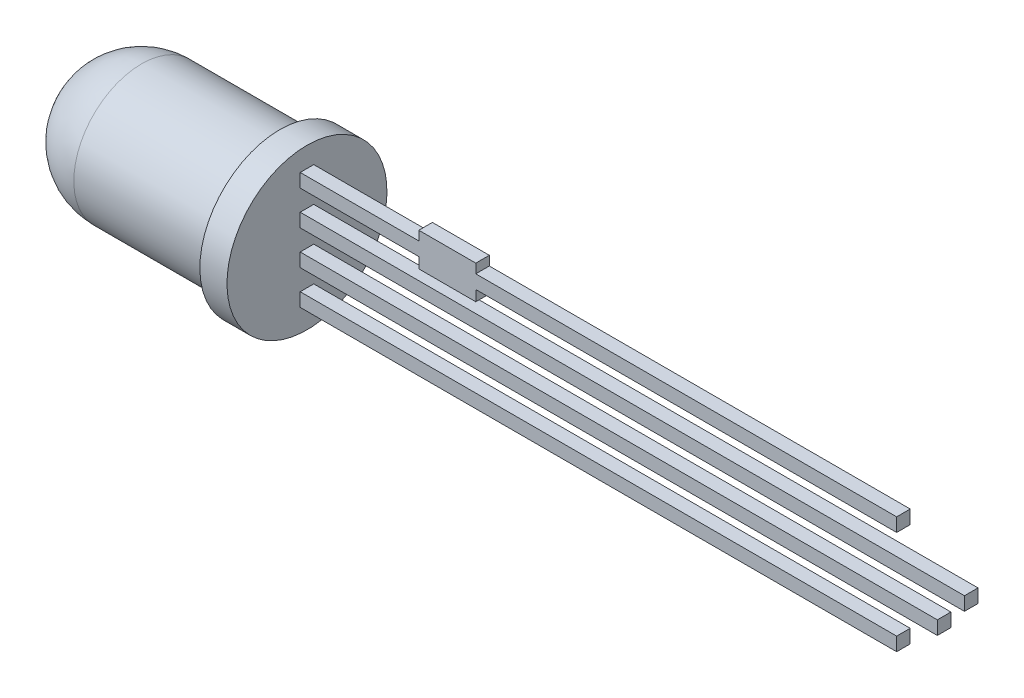
ISO-10303-21;
HEADER;
FILE_DESCRIPTION(('STEP AP214'),'2;1');
FILE_NAME('part.step','',(''),(''),'','','');
FILE_SCHEMA(('AUTOMOTIVE_DESIGN { 1 0 10303 214 1 1 1 1 }'));
ENDSEC;
DATA;
#1=APPLICATION_CONTEXT('core data for automotive mechanical design processes');
#2=APPLICATION_PROTOCOL_DEFINITION('international standard','automotive_design',2000,#1);
#3=PRODUCT_CONTEXT('',#1,'mechanical');
#4=PRODUCT('Part','Part','',(#3));
#5=PRODUCT_RELATED_PRODUCT_CATEGORY('part','',(#4));
#6=PRODUCT_DEFINITION_FORMATION('','',#4);
#7=PRODUCT_DEFINITION_CONTEXT('part definition',#1,'design');
#8=PRODUCT_DEFINITION('design','',#6,#7);
#9=PRODUCT_DEFINITION_SHAPE('','',#8);
#10=(LENGTH_UNIT() NAMED_UNIT(*) SI_UNIT(.MILLI.,.METRE.));
#11=(NAMED_UNIT(*) PLANE_ANGLE_UNIT() SI_UNIT($,.RADIAN.));
#12=(NAMED_UNIT(*) SI_UNIT($,.STERADIAN.) SOLID_ANGLE_UNIT());
#13=UNCERTAINTY_MEASURE_WITH_UNIT(LENGTH_MEASURE(1.E-05),#10,'distance_accuracy_value','');
#14=(GEOMETRIC_REPRESENTATION_CONTEXT(3) GLOBAL_UNCERTAINTY_ASSIGNED_CONTEXT((#13)) GLOBAL_UNIT_ASSIGNED_CONTEXT((#10,
#11,#12)) REPRESENTATION_CONTEXT('',''));
#15=CARTESIAN_POINT('',(0.,0.,0.));
#16=DIRECTION('',(0.,0.,1.));
#17=DIRECTION('',(1.,0.,0.));
#18=AXIS2_PLACEMENT_3D('',#15,#16,#17);
#19=CARTESIAN_POINT('',(-12.1,0.,0.));
#20=DIRECTION('',(1.,0.,0.));
#21=DIRECTION('',(0.,1.,0.));
#22=AXIS2_PLACEMENT_3D('',#19,#20,#21);
#23=SPHERICAL_SURFACE('',#22,2.5);
#24=CARTESIAN_POINT('',(-12.1,0.,0.));
#25=DIRECTION('',(1.,0.,0.));
#26=DIRECTION('',(0.,1.,0.));
#27=AXIS2_PLACEMENT_3D('',#24,#25,#26);
#28=CIRCLE('',#27,2.5);
#29=CARTESIAN_POINT('',(-12.1,2.5,0.));
#30=VERTEX_POINT('',#29);
#31=EDGE_CURVE('E12',#30,#30,#28,.T.);
#32=ORIENTED_EDGE('',*,*,#31,.F.);
#33=EDGE_LOOP('',(#32));
#34=FACE_BOUND('',#33,.T.);
#35=ADVANCED_FACE('F83',(#34),#23,.T.);
#36=CARTESIAN_POINT('',(-6.,0.,0.));
#37=DIRECTION('',(1.,0.,0.));
#38=DIRECTION('',(0.,1.,0.));
#39=AXIS2_PLACEMENT_3D('',#36,#37,#38);
#40=CYLINDRICAL_SURFACE('',#39,2.5);
#41=CARTESIAN_POINT('',(-7.,0.,0.));
#42=DIRECTION('',(1.,0.,0.));
#43=DIRECTION('',(0.,1.,0.));
#44=AXIS2_PLACEMENT_3D('',#41,#42,#43);
#45=CIRCLE('',#44,2.5);
#46=CARTESIAN_POINT('',(-7.,2.5,0.));
#47=VERTEX_POINT('',#46);
#48=EDGE_CURVE('E90',#47,#47,#45,.T.);
#49=ORIENTED_EDGE('',*,*,#48,.F.);
#50=EDGE_LOOP('',(#49));
#51=FACE_BOUND('',#50,.T.);
#52=ORIENTED_EDGE('',*,*,#31,.T.);
#53=EDGE_LOOP('',(#52));
#54=FACE_BOUND('',#53,.T.);
#55=ADVANCED_FACE('F430',(#51,#54),#40,.T.);
#56=CARTESIAN_POINT('',(-7.,-2.95,0.));
#57=DIRECTION('',(1.,0.,0.));
#58=DIRECTION('',(0.,1.,0.));
#59=AXIS2_PLACEMENT_3D('',#56,#57,#58);
#60=PLANE('',#59);
#61=CARTESIAN_POINT('',(-7.,0.,0.));
#62=DIRECTION('',(1.,0.,0.));
#63=DIRECTION('',(0.,1.,0.));
#64=AXIS2_PLACEMENT_3D('',#61,#62,#63);
#65=CIRCLE('',#64,2.95);
#66=CARTESIAN_POINT('',(-7.,2.95,0.));
#67=VERTEX_POINT('',#66);
#68=EDGE_CURVE('E423',#67,#67,#65,.T.);
#69=ORIENTED_EDGE('',*,*,#68,.F.);
#70=EDGE_LOOP('',(#69));
#71=FACE_BOUND('',#70,.T.);
#72=ORIENTED_EDGE('',*,*,#48,.T.);
#73=EDGE_LOOP('',(#72));
#74=FACE_BOUND('',#73,.T.);
#75=ADVANCED_FACE('F428',(#71,#74),#60,.F.);
#76=CARTESIAN_POINT('',(-6.,0.,0.));
#77=DIRECTION('',(1.,0.,0.));
#78=DIRECTION('',(0.,1.,0.));
#79=AXIS2_PLACEMENT_3D('',#76,#77,#78);
#80=CYLINDRICAL_SURFACE('',#79,2.95);
#81=CARTESIAN_POINT('',(-6.,0.,0.));
#82=DIRECTION('',(1.,0.,0.));
#83=DIRECTION('',(0.,1.,0.));
#84=AXIS2_PLACEMENT_3D('',#81,#82,#83);
#85=CIRCLE('',#84,2.95);
#86=CARTESIAN_POINT('',(-6.,2.95,0.));
#87=VERTEX_POINT('',#86);
#88=EDGE_CURVE('E415',#87,#87,#85,.T.);
#89=ORIENTED_EDGE('',*,*,#88,.F.);
#90=EDGE_LOOP('',(#89));
#91=FACE_BOUND('',#90,.T.);
#92=ORIENTED_EDGE('',*,*,#68,.T.);
#93=EDGE_LOOP('',(#92));
#94=FACE_BOUND('',#93,.T.);
#95=ADVANCED_FACE('F448',(#91,#94),#80,.T.);
#96=CARTESIAN_POINT('',(-6.,0.,0.));
#97=DIRECTION('',(-1.,0.,0.));
#98=DIRECTION('',(0.,-1.,0.));
#99=AXIS2_PLACEMENT_3D('',#96,#97,#98);
#100=PLANE('',#99);
#101=DIRECTION('',(0.,0.,1.));
#102=VECTOR('',#101,1.);
#103=CARTESIAN_POINT('',(-6.,0.434737818962526,-0.25));
#104=LINE('',#103,#102);
#105=CARTESIAN_POINT('',(-6.,0.434737818962526,-0.25));
#106=VERTEX_POINT('',#105);
#107=CARTESIAN_POINT('',(-6.,0.434737818962526,0.25));
#108=VERTEX_POINT('',#107);
#109=EDGE_CURVE('E102',#106,#108,#104,.T.);
#110=ORIENTED_EDGE('',*,*,#109,.T.);
#111=DIRECTION('',(0.,1.,0.));
#112=VECTOR('',#111,1.);
#113=CARTESIAN_POINT('',(-6.,0.,0.25));
#114=LINE('',#113,#112);
#115=CARTESIAN_POINT('',(-6.,0.934737818962526,0.25));
#116=VERTEX_POINT('',#115);
#117=EDGE_CURVE('E97',#108,#116,#114,.T.);
#118=ORIENTED_EDGE('',*,*,#117,.T.);
#119=DIRECTION('',(0.,0.,1.));
#120=VECTOR('',#119,1.);
#121=CARTESIAN_POINT('',(-6.,0.934737818962526,-0.25));
#122=LINE('',#121,#120);
#123=CARTESIAN_POINT('',(-6.,0.934737818962526,-0.25));
#124=VERTEX_POINT('',#123);
#125=EDGE_CURVE('E238',#124,#116,#122,.T.);
#126=ORIENTED_EDGE('',*,*,#125,.F.);
#127=DIRECTION('',(0.,1.,0.));
#128=VECTOR('',#127,1.);
#129=CARTESIAN_POINT('',(-6.,0.,-0.25));
#130=LINE('',#129,#128);
#131=EDGE_CURVE('E243',#106,#124,#130,.T.);
#132=ORIENTED_EDGE('',*,*,#131,.F.);
#133=EDGE_LOOP('',(#110,#118,#126,#132));
#134=FACE_BOUND('',#133,.T.);
#135=DIRECTION('',(0.,0.,1.));
#136=VECTOR('',#135,1.);
#137=CARTESIAN_POINT('',(-6.,-2.10526218103747,-0.25));
#138=LINE('',#137,#136);
#139=CARTESIAN_POINT('',(-6.,-2.10526218103747,-0.25));
#140=VERTEX_POINT('',#139);
#141=CARTESIAN_POINT('',(-6.,-2.10526218103747,0.25));
#142=VERTEX_POINT('',#141);
#143=EDGE_CURVE('E275',#140,#142,#138,.T.);
#144=ORIENTED_EDGE('',*,*,#143,.T.);
#145=DIRECTION('',(0.,1.,0.));
#146=VECTOR('',#145,1.);
#147=CARTESIAN_POINT('',(-6.,0.,0.25));
#148=LINE('',#147,#146);
#149=CARTESIAN_POINT('',(-6.,-1.60526218103747,0.25));
#150=VERTEX_POINT('',#149);
#151=EDGE_CURVE('E285',#142,#150,#148,.T.);
#152=ORIENTED_EDGE('',*,*,#151,.T.);
#153=DIRECTION('',(0.,0.,1.));
#154=VECTOR('',#153,1.);
#155=CARTESIAN_POINT('',(-6.,-1.60526218103747,-0.25));
#156=LINE('',#155,#154);
#157=CARTESIAN_POINT('',(-6.,-1.60526218103747,-0.25));
#158=VERTEX_POINT('',#157);
#159=EDGE_CURVE('E282',#158,#150,#156,.T.);
#160=ORIENTED_EDGE('',*,*,#159,.F.);
#161=DIRECTION('',(0.,1.,0.));
#162=VECTOR('',#161,1.);
#163=CARTESIAN_POINT('',(-6.,0.,-0.25));
#164=LINE('',#163,#162);
#165=EDGE_CURVE('E292',#140,#158,#164,.T.);
#166=ORIENTED_EDGE('',*,*,#165,.F.);
#167=EDGE_LOOP('',(#144,#152,#160,#166));
#168=FACE_BOUND('',#167,.T.);
#169=DIRECTION('',(0.,0.,1.));
#170=VECTOR('',#169,1.);
#171=CARTESIAN_POINT('',(-6.,-0.835262181037474,-0.25));
#172=LINE('',#171,#170);
#173=CARTESIAN_POINT('',(-6.,-0.835262181037474,-0.25));
#174=VERTEX_POINT('',#173);
#175=CARTESIAN_POINT('',(-6.,-0.835262181037474,0.25));
#176=VERTEX_POINT('',#175);
#177=EDGE_CURVE('E305',#174,#176,#172,.T.);
#178=ORIENTED_EDGE('',*,*,#177,.T.);
#179=DIRECTION('',(0.,1.,0.));
#180=VECTOR('',#179,1.);
#181=CARTESIAN_POINT('',(-6.,0.,0.25));
#182=LINE('',#181,#180);
#183=CARTESIAN_POINT('',(-6.,-0.335262181037474,0.25));
#184=VERTEX_POINT('',#183);
#185=EDGE_CURVE('E315',#176,#184,#182,.T.);
#186=ORIENTED_EDGE('',*,*,#185,.T.);
#187=DIRECTION('',(0.,0.,1.));
#188=VECTOR('',#187,1.);
#189=CARTESIAN_POINT('',(-6.,-0.335262181037474,-0.25));
#190=LINE('',#189,#188);
#191=CARTESIAN_POINT('',(-6.,-0.335262181037474,-0.25));
#192=VERTEX_POINT('',#191);
#193=EDGE_CURVE('E312',#192,#184,#190,.T.);
#194=ORIENTED_EDGE('',*,*,#193,.F.);
#195=DIRECTION('',(0.,1.,0.));
#196=VECTOR('',#195,1.);
#197=CARTESIAN_POINT('',(-6.,0.,-0.25));
#198=LINE('',#197,#196);
#199=EDGE_CURVE('E322',#174,#192,#198,.T.);
#200=ORIENTED_EDGE('',*,*,#199,.F.);
#201=EDGE_LOOP('',(#178,#186,#194,#200));
#202=FACE_BOUND('',#201,.T.);
#203=DIRECTION('',(0.,1.,0.));
#204=VECTOR('',#203,1.);
#205=CARTESIAN_POINT('',(-6.,0.,0.25));
#206=LINE('',#205,#204);
#207=CARTESIAN_POINT('',(-6.,1.70473781896253,0.25));
#208=VERTEX_POINT('',#207);
#209=CARTESIAN_POINT('',(-6.,2.20473781896253,0.25));
#210=VERTEX_POINT('',#209);
#211=EDGE_CURVE('E381',#208,#210,#206,.T.);
#212=ORIENTED_EDGE('',*,*,#211,.T.);
#213=DIRECTION('',(0.,0.,-1.));
#214=VECTOR('',#213,1.);
#215=CARTESIAN_POINT('',(-6.,2.20473781896253,0.25));
#216=LINE('',#215,#214);
#217=CARTESIAN_POINT('',(-6.,2.20473781896253,-0.25));
#218=VERTEX_POINT('',#217);
#219=EDGE_CURVE('E390',#210,#218,#216,.T.);
#220=ORIENTED_EDGE('',*,*,#219,.T.);
#221=DIRECTION('',(0.,1.,0.));
#222=VECTOR('',#221,1.);
#223=CARTESIAN_POINT('',(-6.,0.,-0.25));
#224=LINE('',#223,#222);
#225=CARTESIAN_POINT('',(-6.,1.70473781896253,-0.25));
#226=VERTEX_POINT('',#225);
#227=EDGE_CURVE('E351',#226,#218,#224,.T.);
#228=ORIENTED_EDGE('',*,*,#227,.F.);
#229=DIRECTION('',(0.,0.,-1.));
#230=VECTOR('',#229,1.);
#231=CARTESIAN_POINT('',(-6.,1.70473781896253,0.25));
#232=LINE('',#231,#230);
#233=EDGE_CURVE('E388',#208,#226,#232,.T.);
#234=ORIENTED_EDGE('',*,*,#233,.F.);
#235=EDGE_LOOP('',(#212,#220,#228,#234));
#236=FACE_BOUND('',#235,.T.);
#237=ORIENTED_EDGE('',*,*,#88,.T.);
#238=EDGE_LOOP('',(#237));
#239=FACE_BOUND('',#238,.T.);
#240=ADVANCED_FACE('F240',(#134,#168,#202,#236,#239),#100,.F.);
#241=CARTESIAN_POINT('',(0.,2.20473781896253,-0.25));
#242=DIRECTION('',(0.,-1.,0.));
#243=DIRECTION('',(1.,0.,0.));
#244=AXIS2_PLACEMENT_3D('',#241,#242,#243);
#245=PLANE('',#244);
#246=DIRECTION('',(0.,0.,1.));
#247=VECTOR('',#246,1.);
#248=CARTESIAN_POINT('',(0.476418130380952,2.20473781896253,-0.25));
#249=LINE('',#248,#247);
#250=CARTESIAN_POINT('',(0.476418130380952,2.20473781896253,-0.25));
#251=VERTEX_POINT('',#250);
#252=CARTESIAN_POINT('',(0.476418130380952,2.20473781896253,0.25));
#253=VERTEX_POINT('',#252);
#254=EDGE_CURVE('E412',#251,#253,#249,.T.);
#255=ORIENTED_EDGE('',*,*,#254,.T.);
#256=DIRECTION('',(1.,0.,0.));
#257=VECTOR('',#256,1.);
#258=CARTESIAN_POINT('',(0.,2.20473781896253,0.25));
#259=LINE('',#258,#257);
#260=CARTESIAN_POINT('',(16.,2.20473781896253,0.25));
#261=VERTEX_POINT('',#260);
#262=EDGE_CURVE('E395',#253,#261,#259,.T.);
#263=ORIENTED_EDGE('',*,*,#262,.T.);
#264=DIRECTION('',(0.,0.,1.));
#265=VECTOR('',#264,1.);
#266=CARTESIAN_POINT('',(16.,2.20473781896253,-0.25));
#267=LINE('',#266,#265);
#268=CARTESIAN_POINT('',(16.,2.20473781896253,-0.25));
#269=VERTEX_POINT('',#268);
#270=EDGE_CURVE('E413',#269,#261,#267,.T.);
#271=ORIENTED_EDGE('',*,*,#270,.F.);
#272=DIRECTION('',(1.,0.,0.));
#273=VECTOR('',#272,1.);
#274=CARTESIAN_POINT('',(0.,2.20473781896253,-0.25));
#275=LINE('',#274,#273);
#276=EDGE_CURVE('E404',#251,#269,#275,.T.);
#277=ORIENTED_EDGE('',*,*,#276,.F.);
#278=EDGE_LOOP('',(#255,#263,#271,#277));
#279=FACE_BOUND('',#278,.T.);
#280=ADVANCED_FACE('F463',(#279),#245,.F.);
#281=CARTESIAN_POINT('',(16.,0.,-0.25));
#282=DIRECTION('',(-1.,0.,0.));
#283=DIRECTION('',(0.,0.,1.));
#284=AXIS2_PLACEMENT_3D('',#281,#282,#283);
#285=PLANE('',#284);
#286=ORIENTED_EDGE('',*,*,#270,.T.);
#287=DIRECTION('',(0.,-1.,0.));
#288=VECTOR('',#287,1.);
#289=CARTESIAN_POINT('',(16.,0.,0.25));
#290=LINE('',#289,#288);
#291=CARTESIAN_POINT('',(16.,1.70473781896253,0.25));
#292=VERTEX_POINT('',#291);
#293=EDGE_CURVE('E401',#261,#292,#290,.T.);
#294=ORIENTED_EDGE('',*,*,#293,.T.);
#295=DIRECTION('',(0.,0.,1.));
#296=VECTOR('',#295,1.);
#297=CARTESIAN_POINT('',(16.,1.70473781896253,-0.25));
#298=LINE('',#297,#296);
#299=CARTESIAN_POINT('',(16.,1.70473781896253,-0.25));
#300=VERTEX_POINT('',#299);
#301=EDGE_CURVE('E416',#300,#292,#298,.T.);
#302=ORIENTED_EDGE('',*,*,#301,.F.);
#303=DIRECTION('',(0.,-1.,0.));
#304=VECTOR('',#303,1.);
#305=CARTESIAN_POINT('',(16.,0.,-0.25));
#306=LINE('',#305,#304);
#307=EDGE_CURVE('E410',#269,#300,#306,.T.);
#308=ORIENTED_EDGE('',*,*,#307,.F.);
#309=EDGE_LOOP('',(#286,#294,#302,#308));
#310=FACE_BOUND('',#309,.T.);
#311=ADVANCED_FACE('F470',(#310),#285,.F.);
#312=CARTESIAN_POINT('',(0.,1.70473781896253,-0.25));
#313=DIRECTION('',(0.,1.,0.));
#314=DIRECTION('',(-1.,0.,0.));
#315=AXIS2_PLACEMENT_3D('',#312,#313,#314);
#316=PLANE('',#315);
#317=ORIENTED_EDGE('',*,*,#301,.T.);
#318=DIRECTION('',(-1.,0.,0.));
#319=VECTOR('',#318,1.);
#320=CARTESIAN_POINT('',(0.,1.70473781896253,0.25));
#321=LINE('',#320,#319);
#322=CARTESIAN_POINT('',(0.476418130380952,1.70473781896253,0.25));
#323=VERTEX_POINT('',#322);
#324=EDGE_CURVE('E398',#292,#323,#321,.T.);
#325=ORIENTED_EDGE('',*,*,#324,.T.);
#326=DIRECTION('',(0.,0.,1.));
#327=VECTOR('',#326,1.);
#328=CARTESIAN_POINT('',(0.476418130380952,1.70473781896253,-0.25));
#329=LINE('',#328,#327);
#330=CARTESIAN_POINT('',(0.476418130380952,1.70473781896253,-0.25));
#331=VERTEX_POINT('',#330);
#332=EDGE_CURVE('E418',#331,#323,#329,.T.);
#333=ORIENTED_EDGE('',*,*,#332,.F.);
#334=DIRECTION('',(-1.,0.,0.));
#335=VECTOR('',#334,1.);
#336=CARTESIAN_POINT('',(0.,1.70473781896253,-0.25));
#337=LINE('',#336,#335);
#338=EDGE_CURVE('E407',#300,#331,#337,.T.);
#339=ORIENTED_EDGE('',*,*,#338,.F.);
#340=EDGE_LOOP('',(#317,#325,#333,#339));
#341=FACE_BOUND('',#340,.T.);
#342=ADVANCED_FACE('F478',(#341),#316,.F.);
#343=CARTESIAN_POINT('',(0.,0.,-0.25));
#344=DIRECTION('',(0.,0.,1.));
#345=DIRECTION('',(1.,0.,0.));
#346=AXIS2_PLACEMENT_3D('',#343,#344,#345);
#347=PLANE('',#346);
#348=ORIENTED_EDGE('',*,*,#276,.T.);
#349=ORIENTED_EDGE('',*,*,#307,.T.);
#350=ORIENTED_EDGE('',*,*,#338,.T.);
#351=DIRECTION('',(0.,-1.,0.));
#352=VECTOR('',#351,1.);
#353=CARTESIAN_POINT('',(0.476418130380952,2.54708834230275,-0.25));
#354=LINE('',#353,#352);
#355=CARTESIAN_POINT('',(0.476418130380952,1.31177660540802,-0.25));
#356=VERTEX_POINT('',#355);
#357=EDGE_CURVE('E341',#331,#356,#354,.T.);
#358=ORIENTED_EDGE('',*,*,#357,.T.);
#359=DIRECTION('',(1.,0.,0.));
#360=VECTOR('',#359,1.);
#361=CARTESIAN_POINT('',(-1.62374591057098,1.31177660540802,-0.25));
#362=LINE('',#361,#360);
#363=CARTESIAN_POINT('',(-1.62374591057098,1.31177660540802,-0.25));
#364=VERTEX_POINT('',#363);
#365=EDGE_CURVE('E338',#364,#356,#362,.T.);
#366=ORIENTED_EDGE('',*,*,#365,.F.);
#367=DIRECTION('',(0.,-1.,0.));
#368=VECTOR('',#367,1.);
#369=CARTESIAN_POINT('',(-1.62374591057098,2.54708834230275,-0.25));
#370=LINE('',#369,#368);
#371=CARTESIAN_POINT('',(-1.62374591057098,1.70473781896253,-0.25));
#372=VERTEX_POINT('',#371);
#373=EDGE_CURVE('E325',#372,#364,#370,.T.);
#374=ORIENTED_EDGE('',*,*,#373,.F.);
#375=DIRECTION('',(-1.,0.,0.));
#376=VECTOR('',#375,1.);
#377=CARTESIAN_POINT('',(0.,1.70473781896253,-0.25));
#378=LINE('',#377,#376);
#379=EDGE_CURVE('E353',#372,#226,#378,.T.);
#380=ORIENTED_EDGE('',*,*,#379,.T.);
#381=ORIENTED_EDGE('',*,*,#227,.T.);
#382=DIRECTION('',(1.,0.,0.));
#383=VECTOR('',#382,1.);
#384=CARTESIAN_POINT('',(0.,2.20473781896253,-0.25));
#385=LINE('',#384,#383);
#386=CARTESIAN_POINT('',(-1.62374591057098,2.20473781896253,-0.25));
#387=VERTEX_POINT('',#386);
#388=EDGE_CURVE('E348',#218,#387,#385,.T.);
#389=ORIENTED_EDGE('',*,*,#388,.T.);
#390=CARTESIAN_POINT('',(-1.62374591057098,2.54708834230275,-0.25));
#391=VERTEX_POINT('',#390);
#392=EDGE_CURVE('E335',#391,#387,#370,.T.);
#393=ORIENTED_EDGE('',*,*,#392,.F.);
#394=DIRECTION('',(1.,0.,0.));
#395=VECTOR('',#394,1.);
#396=CARTESIAN_POINT('',(-1.62374591057098,2.54708834230275,-0.25));
#397=LINE('',#396,#395);
#398=CARTESIAN_POINT('',(0.476418130380952,2.54708834230275,-0.25));
#399=VERTEX_POINT('',#398);
#400=EDGE_CURVE('E345',#391,#399,#397,.T.);
#401=ORIENTED_EDGE('',*,*,#400,.T.);
#402=EDGE_CURVE('E342',#399,#251,#354,.T.);
#403=ORIENTED_EDGE('',*,*,#402,.T.);
#404=EDGE_LOOP('',(#348,#349,#350,#358,#366,#374,#380,#381,#389,#393,#401,#403));
#405=FACE_BOUND('',#404,.T.);
#406=ADVANCED_FACE('F486',(#405),#347,.F.);
#407=CARTESIAN_POINT('',(0.476418130380952,2.54708834230275,0.25));
#408=DIRECTION('',(1.,0.,0.));
#409=DIRECTION('',(0.,0.,-1.));
#410=AXIS2_PLACEMENT_3D('',#407,#408,#409);
#411=PLANE('',#410);
#412=ORIENTED_EDGE('',*,*,#254,.F.);
#413=ORIENTED_EDGE('',*,*,#402,.F.);
#414=DIRECTION('',(0.,0.,-1.));
#415=VECTOR('',#414,1.);
#416=CARTESIAN_POINT('',(0.476418130380952,2.54708834230275,0.25));
#417=LINE('',#416,#415);
#418=CARTESIAN_POINT('',(0.476418130380952,2.54708834230275,0.25));
#419=VERTEX_POINT('',#418);
#420=EDGE_CURVE('E372',#419,#399,#417,.T.);
#421=ORIENTED_EDGE('',*,*,#420,.F.);
#422=DIRECTION('',(0.,-1.,0.));
#423=VECTOR('',#422,1.);
#424=CARTESIAN_POINT('',(0.476418130380952,2.54708834230275,0.25));
#425=LINE('',#424,#423);
#426=EDGE_CURVE('E364',#419,#253,#425,.T.);
#427=ORIENTED_EDGE('',*,*,#426,.T.);
#428=EDGE_LOOP('',(#412,#413,#421,#427));
#429=FACE_BOUND('',#428,.T.);
#430=ADVANCED_FACE('F494',(#429),#411,.T.);
#431=ORIENTED_EDGE('',*,*,#332,.T.);
#432=CARTESIAN_POINT('',(0.476418130380952,1.31177660540802,0.25));
#433=VERTEX_POINT('',#432);
#434=EDGE_CURVE('E363',#323,#433,#425,.T.);
#435=ORIENTED_EDGE('',*,*,#434,.T.);
#436=DIRECTION('',(0.,0.,-1.));
#437=VECTOR('',#436,1.);
#438=CARTESIAN_POINT('',(0.476418130380952,1.31177660540802,0.25));
#439=LINE('',#438,#437);
#440=EDGE_CURVE('E374',#433,#356,#439,.T.);
#441=ORIENTED_EDGE('',*,*,#440,.T.);
#442=ORIENTED_EDGE('',*,*,#357,.F.);
#443=EDGE_LOOP('',(#431,#435,#441,#442));
#444=FACE_BOUND('',#443,.T.);
#445=ADVANCED_FACE('F502',(#444),#411,.T.);
#446=CARTESIAN_POINT('',(0.,0.,0.25));
#447=DIRECTION('',(0.,0.,1.));
#448=DIRECTION('',(1.,0.,0.));
#449=AXIS2_PLACEMENT_3D('',#446,#447,#448);
#450=PLANE('',#449);
#451=ORIENTED_EDGE('',*,*,#262,.F.);
#452=ORIENTED_EDGE('',*,*,#426,.F.);
#453=DIRECTION('',(1.,0.,0.));
#454=VECTOR('',#453,1.);
#455=CARTESIAN_POINT('',(-1.62374591057098,2.54708834230275,0.25));
#456=LINE('',#455,#454);
#457=CARTESIAN_POINT('',(-1.62374591057098,2.54708834230275,0.25));
#458=VERTEX_POINT('',#457);
#459=EDGE_CURVE('E367',#458,#419,#456,.T.);
#460=ORIENTED_EDGE('',*,*,#459,.F.);
#461=DIRECTION('',(0.,-1.,0.));
#462=VECTOR('',#461,1.);
#463=CARTESIAN_POINT('',(-1.62374591057098,2.54708834230275,0.25));
#464=LINE('',#463,#462);
#465=CARTESIAN_POINT('',(-1.62374591057098,2.20473781896253,0.25));
#466=VERTEX_POINT('',#465);
#467=EDGE_CURVE('E357',#458,#466,#464,.T.);
#468=ORIENTED_EDGE('',*,*,#467,.T.);
#469=DIRECTION('',(1.,0.,0.));
#470=VECTOR('',#469,1.);
#471=CARTESIAN_POINT('',(0.,2.20473781896253,0.25));
#472=LINE('',#471,#470);
#473=EDGE_CURVE('E379',#210,#466,#472,.T.);
#474=ORIENTED_EDGE('',*,*,#473,.F.);
#475=ORIENTED_EDGE('',*,*,#211,.F.);
#476=DIRECTION('',(-1.,0.,0.));
#477=VECTOR('',#476,1.);
#478=CARTESIAN_POINT('',(0.,1.70473781896253,0.25));
#479=LINE('',#478,#477);
#480=CARTESIAN_POINT('',(-1.62374591057098,1.70473781896253,0.25));
#481=VERTEX_POINT('',#480);
#482=EDGE_CURVE('E384',#481,#208,#479,.T.);
#483=ORIENTED_EDGE('',*,*,#482,.F.);
#484=CARTESIAN_POINT('',(-1.62374591057098,1.31177660540802,0.25));
#485=VERTEX_POINT('',#484);
#486=EDGE_CURVE('E356',#481,#485,#464,.T.);
#487=ORIENTED_EDGE('',*,*,#486,.T.);
#488=DIRECTION('',(1.,0.,0.));
#489=VECTOR('',#488,1.);
#490=CARTESIAN_POINT('',(-1.62374591057098,1.31177660540802,0.25));
#491=LINE('',#490,#489);
#492=EDGE_CURVE('E360',#485,#433,#491,.T.);
#493=ORIENTED_EDGE('',*,*,#492,.T.);
#494=ORIENTED_EDGE('',*,*,#434,.F.);
#495=ORIENTED_EDGE('',*,*,#324,.F.);
#496=ORIENTED_EDGE('',*,*,#293,.F.);
#497=EDGE_LOOP('',(#451,#452,#460,#468,#474,#475,#483,#487,#493,#494,#495,#496));
#498=FACE_BOUND('',#497,.T.);
#499=ADVANCED_FACE('F510',(#498),#450,.T.);
#500=CARTESIAN_POINT('',(0.,2.20473781896253,0.25));
#501=DIRECTION('',(0.,1.,0.));
#502=DIRECTION('',(-1.,0.,0.));
#503=AXIS2_PLACEMENT_3D('',#500,#501,#502);
#504=PLANE('',#503);
#505=DIRECTION('',(0.,0.,-1.));
#506=VECTOR('',#505,1.);
#507=CARTESIAN_POINT('',(-1.62374591057098,2.20473781896253,0.25));
#508=LINE('',#507,#506);
#509=EDGE_CURVE('E393',#466,#387,#508,.T.);
#510=ORIENTED_EDGE('',*,*,#509,.T.);
#511=ORIENTED_EDGE('',*,*,#388,.F.);
#512=ORIENTED_EDGE('',*,*,#219,.F.);
#513=ORIENTED_EDGE('',*,*,#473,.T.);
#514=EDGE_LOOP('',(#510,#511,#512,#513));
#515=FACE_BOUND('',#514,.T.);
#516=ADVANCED_FACE('F517',(#515),#504,.T.);
#517=CARTESIAN_POINT('',(0.,1.70473781896253,0.25));
#518=DIRECTION('',(0.,-1.,0.));
#519=DIRECTION('',(1.,0.,0.));
#520=AXIS2_PLACEMENT_3D('',#517,#518,#519);
#521=PLANE('',#520);
#522=ORIENTED_EDGE('',*,*,#233,.T.);
#523=ORIENTED_EDGE('',*,*,#379,.F.);
#524=DIRECTION('',(0.,0.,-1.));
#525=VECTOR('',#524,1.);
#526=CARTESIAN_POINT('',(-1.62374591057098,1.70473781896253,0.25));
#527=LINE('',#526,#525);
#528=EDGE_CURVE('E386',#481,#372,#527,.T.);
#529=ORIENTED_EDGE('',*,*,#528,.F.);
#530=ORIENTED_EDGE('',*,*,#482,.T.);
#531=EDGE_LOOP('',(#522,#523,#529,#530));
#532=FACE_BOUND('',#531,.T.);
#533=ADVANCED_FACE('F525',(#532),#521,.T.);
#534=CARTESIAN_POINT('',(-1.62374591057098,2.54708834230275,0.25));
#535=DIRECTION('',(1.,0.,0.));
#536=DIRECTION('',(0.,1.,0.));
#537=AXIS2_PLACEMENT_3D('',#534,#535,#536);
#538=PLANE('',#537);
#539=ORIENTED_EDGE('',*,*,#509,.F.);
#540=ORIENTED_EDGE('',*,*,#467,.F.);
#541=DIRECTION('',(0.,0.,-1.));
#542=VECTOR('',#541,1.);
#543=CARTESIAN_POINT('',(-1.62374591057098,2.54708834230275,0.25));
#544=LINE('',#543,#542);
#545=EDGE_CURVE('E370',#458,#391,#544,.T.);
#546=ORIENTED_EDGE('',*,*,#545,.T.);
#547=ORIENTED_EDGE('',*,*,#392,.T.);
#548=EDGE_LOOP('',(#539,#540,#546,#547));
#549=FACE_BOUND('',#548,.T.);
#550=ADVANCED_FACE('F533',(#549),#538,.F.);
#551=ORIENTED_EDGE('',*,*,#528,.T.);
#552=ORIENTED_EDGE('',*,*,#373,.T.);
#553=DIRECTION('',(0.,0.,-1.));
#554=VECTOR('',#553,1.);
#555=CARTESIAN_POINT('',(-1.62374591057098,1.31177660540802,0.25));
#556=LINE('',#555,#554);
#557=EDGE_CURVE('E377',#485,#364,#556,.T.);
#558=ORIENTED_EDGE('',*,*,#557,.F.);
#559=ORIENTED_EDGE('',*,*,#486,.F.);
#560=EDGE_LOOP('',(#551,#552,#558,#559));
#561=FACE_BOUND('',#560,.T.);
#562=ADVANCED_FACE('F541',(#561),#538,.F.);
#563=CARTESIAN_POINT('',(-1.62374591057098,1.31177660540802,0.25));
#564=DIRECTION('',(0.,1.,0.));
#565=DIRECTION('',(0.,0.,1.));
#566=AXIS2_PLACEMENT_3D('',#563,#564,#565);
#567=PLANE('',#566);
#568=ORIENTED_EDGE('',*,*,#557,.T.);
#569=ORIENTED_EDGE('',*,*,#365,.T.);
#570=ORIENTED_EDGE('',*,*,#440,.F.);
#571=ORIENTED_EDGE('',*,*,#492,.F.);
#572=EDGE_LOOP('',(#568,#569,#570,#571));
#573=FACE_BOUND('',#572,.T.);
#574=ADVANCED_FACE('F549',(#573),#567,.F.);
#575=CARTESIAN_POINT('',(-1.62374591057098,2.54708834230275,0.25));
#576=DIRECTION('',(0.,1.,0.));
#577=DIRECTION('',(0.,0.,1.));
#578=AXIS2_PLACEMENT_3D('',#575,#576,#577);
#579=PLANE('',#578);
#580=ORIENTED_EDGE('',*,*,#420,.T.);
#581=ORIENTED_EDGE('',*,*,#400,.F.);
#582=ORIENTED_EDGE('',*,*,#545,.F.);
#583=ORIENTED_EDGE('',*,*,#459,.T.);
#584=EDGE_LOOP('',(#580,#581,#582,#583));
#585=FACE_BOUND('',#584,.T.);
#586=ADVANCED_FACE('F556',(#585),#579,.T.);
#587=CARTESIAN_POINT('',(0.,-0.835262181037473,0.25));
#588=DIRECTION('',(0.,-1.,0.));
#589=DIRECTION('',(1.,0.,0.));
#590=AXIS2_PLACEMENT_3D('',#587,#588,#589);
#591=PLANE('',#590);
#592=DIRECTION('',(-1.,0.,0.));
#593=VECTOR('',#592,1.);
#594=CARTESIAN_POINT('',(0.,-0.835262181037473,0.25));
#595=LINE('',#594,#593);
#596=CARTESIAN_POINT('',(17.5,-0.835262181037471,0.25));
#597=VERTEX_POINT('',#596);
#598=EDGE_CURVE('E331',#597,#176,#595,.T.);
#599=ORIENTED_EDGE('',*,*,#598,.T.);
#600=ORIENTED_EDGE('',*,*,#177,.F.);
#601=DIRECTION('',(-1.,0.,0.));
#602=VECTOR('',#601,1.);
#603=CARTESIAN_POINT('',(0.,-0.835262181037473,-0.25));
#604=LINE('',#603,#602);
#605=CARTESIAN_POINT('',(17.5,-0.835262181037471,-0.25));
#606=VERTEX_POINT('',#605);
#607=EDGE_CURVE('E319',#606,#174,#604,.T.);
#608=ORIENTED_EDGE('',*,*,#607,.F.);
#609=DIRECTION('',(0.,0.,1.));
#610=VECTOR('',#609,1.);
#611=CARTESIAN_POINT('',(17.5,-0.835262181037471,-0.25));
#612=LINE('',#611,#610);
#613=EDGE_CURVE('E308',#606,#597,#612,.T.);
#614=ORIENTED_EDGE('',*,*,#613,.T.);
#615=EDGE_LOOP('',(#599,#600,#608,#614));
#616=FACE_BOUND('',#615,.T.);
#617=ADVANCED_FACE('F564',(#616),#591,.T.);
#618=CARTESIAN_POINT('',(17.5,0.,0.25));
#619=DIRECTION('',(1.,0.,0.));
#620=DIRECTION('',(0.,0.,-1.));
#621=AXIS2_PLACEMENT_3D('',#618,#619,#620);
#622=PLANE('',#621);
#623=DIRECTION('',(0.,-1.,0.));
#624=VECTOR('',#623,1.);
#625=CARTESIAN_POINT('',(17.5,0.,0.25));
#626=LINE('',#625,#624);
#627=CARTESIAN_POINT('',(17.5,-0.335262181037474,0.25));
#628=VERTEX_POINT('',#627);
#629=EDGE_CURVE('E328',#628,#597,#626,.T.);
#630=ORIENTED_EDGE('',*,*,#629,.T.);
#631=ORIENTED_EDGE('',*,*,#613,.F.);
#632=DIRECTION('',(0.,-1.,0.));
#633=VECTOR('',#632,1.);
#634=CARTESIAN_POINT('',(17.5,0.,-0.25));
#635=LINE('',#634,#633);
#636=CARTESIAN_POINT('',(17.5,-0.335262181037474,-0.25));
#637=VERTEX_POINT('',#636);
#638=EDGE_CURVE('E317',#637,#606,#635,.T.);
#639=ORIENTED_EDGE('',*,*,#638,.F.);
#640=DIRECTION('',(0.,0.,1.));
#641=VECTOR('',#640,1.);
#642=CARTESIAN_POINT('',(17.5,-0.335262181037474,-0.25));
#643=LINE('',#642,#641);
#644=EDGE_CURVE('E310',#637,#628,#643,.T.);
#645=ORIENTED_EDGE('',*,*,#644,.T.);
#646=EDGE_LOOP('',(#630,#631,#639,#645));
#647=FACE_BOUND('',#646,.T.);
#648=ADVANCED_FACE('F573',(#647),#622,.T.);
#649=CARTESIAN_POINT('',(0.,-0.335262181037474,0.25));
#650=DIRECTION('',(0.,1.,0.));
#651=DIRECTION('',(-1.,0.,0.));
#652=AXIS2_PLACEMENT_3D('',#649,#650,#651);
#653=PLANE('',#652);
#654=DIRECTION('',(1.,0.,0.));
#655=VECTOR('',#654,1.);
#656=CARTESIAN_POINT('',(0.,-0.335262181037474,0.25));
#657=LINE('',#656,#655);
#658=EDGE_CURVE('E295',#184,#628,#657,.T.);
#659=ORIENTED_EDGE('',*,*,#658,.T.);
#660=ORIENTED_EDGE('',*,*,#644,.F.);
#661=DIRECTION('',(1.,0.,0.));
#662=VECTOR('',#661,1.);
#663=CARTESIAN_POINT('',(0.,-0.335262181037474,-0.25));
#664=LINE('',#663,#662);
#665=EDGE_CURVE('E307',#192,#637,#664,.T.);
#666=ORIENTED_EDGE('',*,*,#665,.F.);
#667=ORIENTED_EDGE('',*,*,#193,.T.);
#668=EDGE_LOOP('',(#659,#660,#666,#667));
#669=FACE_BOUND('',#668,.T.);
#670=ADVANCED_FACE('F581',(#669),#653,.T.);
#671=CARTESIAN_POINT('',(0.,0.,0.25));
#672=DIRECTION('',(0.,0.,1.));
#673=DIRECTION('',(1.,0.,0.));
#674=AXIS2_PLACEMENT_3D('',#671,#672,#673);
#675=PLANE('',#674);
#676=ORIENTED_EDGE('',*,*,#185,.F.);
#677=ORIENTED_EDGE('',*,*,#598,.F.);
#678=ORIENTED_EDGE('',*,*,#629,.F.);
#679=ORIENTED_EDGE('',*,*,#658,.F.);
#680=EDGE_LOOP('',(#676,#677,#678,#679));
#681=FACE_BOUND('',#680,.T.);
#682=ADVANCED_FACE('F589',(#681),#675,.T.);
#683=CARTESIAN_POINT('',(0.,0.,-0.25));
#684=DIRECTION('',(0.,0.,1.));
#685=DIRECTION('',(1.,0.,0.));
#686=AXIS2_PLACEMENT_3D('',#683,#684,#685);
#687=PLANE('',#686);
#688=ORIENTED_EDGE('',*,*,#199,.T.);
#689=ORIENTED_EDGE('',*,*,#665,.T.);
#690=ORIENTED_EDGE('',*,*,#638,.T.);
#691=ORIENTED_EDGE('',*,*,#607,.T.);
#692=EDGE_LOOP('',(#688,#689,#690,#691));
#693=FACE_BOUND('',#692,.T.);
#694=ADVANCED_FACE('F567',(#693),#687,.F.);
#695=CARTESIAN_POINT('',(0.,-2.10526218103747,0.25));
#696=DIRECTION('',(0.,-1.,0.));
#697=DIRECTION('',(1.,0.,0.));
#698=AXIS2_PLACEMENT_3D('',#695,#696,#697);
#699=PLANE('',#698);
#700=DIRECTION('',(-1.,0.,0.));
#701=VECTOR('',#700,1.);
#702=CARTESIAN_POINT('',(0.,-2.10526218103747,0.25));
#703=LINE('',#702,#701);
#704=CARTESIAN_POINT('',(16.,-2.10526218103747,0.25));
#705=VERTEX_POINT('',#704);
#706=EDGE_CURVE('E301',#705,#142,#703,.T.);
#707=ORIENTED_EDGE('',*,*,#706,.T.);
#708=ORIENTED_EDGE('',*,*,#143,.F.);
#709=DIRECTION('',(-1.,0.,0.));
#710=VECTOR('',#709,1.);
#711=CARTESIAN_POINT('',(0.,-2.10526218103747,-0.25));
#712=LINE('',#711,#710);
#713=CARTESIAN_POINT('',(16.,-2.10526218103747,-0.25));
#714=VERTEX_POINT('',#713);
#715=EDGE_CURVE('E289',#714,#140,#712,.T.);
#716=ORIENTED_EDGE('',*,*,#715,.F.);
#717=DIRECTION('',(0.,0.,1.));
#718=VECTOR('',#717,1.);
#719=CARTESIAN_POINT('',(16.,-2.10526218103747,-0.25));
#720=LINE('',#719,#718);
#721=EDGE_CURVE('E278',#714,#705,#720,.T.);
#722=ORIENTED_EDGE('',*,*,#721,.T.);
#723=EDGE_LOOP('',(#707,#708,#716,#722));
#724=FACE_BOUND('',#723,.T.);
#725=ADVANCED_FACE('F605',(#724),#699,.T.);
#726=CARTESIAN_POINT('',(16.,0.,0.25));
#727=DIRECTION('',(1.,0.,0.));
#728=DIRECTION('',(0.,0.,-1.));
#729=AXIS2_PLACEMENT_3D('',#726,#727,#728);
#730=PLANE('',#729);
#731=DIRECTION('',(0.,-1.,0.));
#732=VECTOR('',#731,1.);
#733=CARTESIAN_POINT('',(16.,0.,0.25));
#734=LINE('',#733,#732);
#735=CARTESIAN_POINT('',(16.,-1.60526218103747,0.25));
#736=VERTEX_POINT('',#735);
#737=EDGE_CURVE('E298',#736,#705,#734,.T.);
#738=ORIENTED_EDGE('',*,*,#737,.T.);
#739=ORIENTED_EDGE('',*,*,#721,.F.);
#740=DIRECTION('',(0.,-1.,0.));
#741=VECTOR('',#740,1.);
#742=CARTESIAN_POINT('',(16.,0.,-0.25));
#743=LINE('',#742,#741);
#744=CARTESIAN_POINT('',(16.,-1.60526218103747,-0.25));
#745=VERTEX_POINT('',#744);
#746=EDGE_CURVE('E287',#745,#714,#743,.T.);
#747=ORIENTED_EDGE('',*,*,#746,.F.);
#748=DIRECTION('',(0.,0.,1.));
#749=VECTOR('',#748,1.);
#750=CARTESIAN_POINT('',(16.,-1.60526218103747,-0.25));
#751=LINE('',#750,#749);
#752=EDGE_CURVE('E280',#745,#736,#751,.T.);
#753=ORIENTED_EDGE('',*,*,#752,.T.);
#754=EDGE_LOOP('',(#738,#739,#747,#753));
#755=FACE_BOUND('',#754,.T.);
#756=ADVANCED_FACE('F613',(#755),#730,.T.);
#757=CARTESIAN_POINT('',(0.,-1.60526218103747,0.25));
#758=DIRECTION('',(0.,1.,0.));
#759=DIRECTION('',(-1.,0.,0.));
#760=AXIS2_PLACEMENT_3D('',#757,#758,#759);
#761=PLANE('',#760);
#762=DIRECTION('',(1.,0.,0.));
#763=VECTOR('',#762,1.);
#764=CARTESIAN_POINT('',(0.,-1.60526218103747,0.25));
#765=LINE('',#764,#763);
#766=EDGE_CURVE('E274',#150,#736,#765,.T.);
#767=ORIENTED_EDGE('',*,*,#766,.T.);
#768=ORIENTED_EDGE('',*,*,#752,.F.);
#769=DIRECTION('',(1.,0.,0.));
#770=VECTOR('',#769,1.);
#771=CARTESIAN_POINT('',(0.,-1.60526218103747,-0.25));
#772=LINE('',#771,#770);
#773=EDGE_CURVE('E277',#158,#745,#772,.T.);
#774=ORIENTED_EDGE('',*,*,#773,.F.);
#775=ORIENTED_EDGE('',*,*,#159,.T.);
#776=EDGE_LOOP('',(#767,#768,#774,#775));
#777=FACE_BOUND('',#776,.T.);
#778=ADVANCED_FACE('F621',(#777),#761,.T.);
#779=CARTESIAN_POINT('',(0.,0.,0.25));
#780=DIRECTION('',(0.,0.,1.));
#781=DIRECTION('',(1.,0.,0.));
#782=AXIS2_PLACEMENT_3D('',#779,#780,#781);
#783=PLANE('',#782);
#784=ORIENTED_EDGE('',*,*,#151,.F.);
#785=ORIENTED_EDGE('',*,*,#706,.F.);
#786=ORIENTED_EDGE('',*,*,#737,.F.);
#787=ORIENTED_EDGE('',*,*,#766,.F.);
#788=EDGE_LOOP('',(#784,#785,#786,#787));
#789=FACE_BOUND('',#788,.T.);
#790=ADVANCED_FACE('F629',(#789),#783,.T.);
#791=CARTESIAN_POINT('',(0.,0.,-0.25));
#792=DIRECTION('',(0.,0.,1.));
#793=DIRECTION('',(1.,0.,0.));
#794=AXIS2_PLACEMENT_3D('',#791,#792,#793);
#795=PLANE('',#794);
#796=ORIENTED_EDGE('',*,*,#165,.T.);
#797=ORIENTED_EDGE('',*,*,#773,.T.);
#798=ORIENTED_EDGE('',*,*,#746,.T.);
#799=ORIENTED_EDGE('',*,*,#715,.T.);
#800=EDGE_LOOP('',(#796,#797,#798,#799));
#801=FACE_BOUND('',#800,.T.);
#802=ADVANCED_FACE('F599',(#801),#795,.F.);
#803=CARTESIAN_POINT('',(0.,0.,0.25));
#804=DIRECTION('',(0.,0.,1.));
#805=DIRECTION('',(1.,0.,0.));
#806=AXIS2_PLACEMENT_3D('',#803,#804,#805);
#807=PLANE('',#806);
#808=ORIENTED_EDGE('',*,*,#117,.F.);
#809=DIRECTION('',(-1.,0.,0.));
#810=VECTOR('',#809,1.);
#811=CARTESIAN_POINT('',(0.,0.434737818962527,0.25));
#812=LINE('',#811,#810);
#813=CARTESIAN_POINT('',(18.5,0.434737818962529,0.25));
#814=VERTEX_POINT('',#813);
#815=EDGE_CURVE('E270',#814,#108,#812,.T.);
#816=ORIENTED_EDGE('',*,*,#815,.F.);
#817=DIRECTION('',(0.,-1.,0.));
#818=VECTOR('',#817,1.);
#819=CARTESIAN_POINT('',(18.5,0.,0.25));
#820=LINE('',#819,#818);
#821=CARTESIAN_POINT('',(18.5,0.934737818962526,0.25));
#822=VERTEX_POINT('',#821);
#823=EDGE_CURVE('E263',#822,#814,#820,.T.);
#824=ORIENTED_EDGE('',*,*,#823,.F.);
#825=DIRECTION('',(1.,0.,0.));
#826=VECTOR('',#825,1.);
#827=CARTESIAN_POINT('',(0.,0.934737818962526,0.25));
#828=LINE('',#827,#826);
#829=EDGE_CURVE('E261',#116,#822,#828,.T.);
#830=ORIENTED_EDGE('',*,*,#829,.F.);
#831=EDGE_LOOP('',(#808,#816,#824,#830));
#832=FACE_BOUND('',#831,.T.);
#833=ADVANCED_FACE('F644',(#832),#807,.T.);
#834=CARTESIAN_POINT('',(0.,0.934737818962526,-0.25));
#835=DIRECTION('',(0.,-1.,0.));
#836=DIRECTION('',(1.,0.,0.));
#837=AXIS2_PLACEMENT_3D('',#834,#835,#836);
#838=PLANE('',#837);
#839=DIRECTION('',(0.,0.,1.));
#840=VECTOR('',#839,1.);
#841=CARTESIAN_POINT('',(18.5,0.934737818962526,-0.25));
#842=LINE('',#841,#840);
#843=CARTESIAN_POINT('',(18.5,0.934737818962526,-0.25));
#844=VERTEX_POINT('',#843);
#845=EDGE_CURVE('E247',#844,#822,#842,.T.);
#846=ORIENTED_EDGE('',*,*,#845,.F.);
#847=DIRECTION('',(1.,0.,0.));
#848=VECTOR('',#847,1.);
#849=CARTESIAN_POINT('',(0.,0.934737818962526,-0.25));
#850=LINE('',#849,#848);
#851=EDGE_CURVE('E250',#124,#844,#850,.T.);
#852=ORIENTED_EDGE('',*,*,#851,.F.);
#853=ORIENTED_EDGE('',*,*,#125,.T.);
#854=ORIENTED_EDGE('',*,*,#829,.T.);
#855=EDGE_LOOP('',(#846,#852,#853,#854));
#856=FACE_BOUND('',#855,.T.);
#857=ADVANCED_FACE('F251',(#856),#838,.F.);
#858=CARTESIAN_POINT('',(18.5,0.,-0.25));
#859=DIRECTION('',(-1.,0.,0.));
#860=DIRECTION('',(0.,0.,1.));
#861=AXIS2_PLACEMENT_3D('',#858,#859,#860);
#862=PLANE('',#861);
#863=DIRECTION('',(0.,0.,1.));
#864=VECTOR('',#863,1.);
#865=CARTESIAN_POINT('',(18.5,0.434737818962529,-0.25));
#866=LINE('',#865,#864);
#867=CARTESIAN_POINT('',(18.5,0.434737818962529,-0.25));
#868=VERTEX_POINT('',#867);
#869=EDGE_CURVE('E792',#868,#814,#866,.T.);
#870=ORIENTED_EDGE('',*,*,#869,.F.);
#871=DIRECTION('',(0.,-1.,0.));
#872=VECTOR('',#871,1.);
#873=CARTESIAN_POINT('',(18.5,0.,-0.25));
#874=LINE('',#873,#872);
#875=EDGE_CURVE('E255',#844,#868,#874,.T.);
#876=ORIENTED_EDGE('',*,*,#875,.F.);
#877=ORIENTED_EDGE('',*,*,#845,.T.);
#878=ORIENTED_EDGE('',*,*,#823,.T.);
#879=EDGE_LOOP('',(#870,#876,#877,#878));
#880=FACE_BOUND('',#879,.T.);
#881=ADVANCED_FACE('F654',(#880),#862,.F.);
#882=CARTESIAN_POINT('',(0.,0.434737818962527,-0.25));
#883=DIRECTION('',(0.,1.,0.));
#884=DIRECTION('',(-1.,0.,0.));
#885=AXIS2_PLACEMENT_3D('',#882,#883,#884);
#886=PLANE('',#885);
#887=ORIENTED_EDGE('',*,*,#109,.F.);
#888=DIRECTION('',(-1.,0.,0.));
#889=VECTOR('',#888,1.);
#890=CARTESIAN_POINT('',(0.,0.434737818962527,-0.25));
#891=LINE('',#890,#889);
#892=EDGE_CURVE('E260',#868,#106,#891,.T.);
#893=ORIENTED_EDGE('',*,*,#892,.F.);
#894=ORIENTED_EDGE('',*,*,#869,.T.);
#895=ORIENTED_EDGE('',*,*,#815,.T.);
#896=EDGE_LOOP('',(#887,#893,#894,#895));
#897=FACE_BOUND('',#896,.T.);
#898=ADVANCED_FACE('F666',(#897),#886,.F.);
#899=CARTESIAN_POINT('',(0.,0.,-0.25));
#900=DIRECTION('',(0.,0.,1.));
#901=DIRECTION('',(1.,0.,0.));
#902=AXIS2_PLACEMENT_3D('',#899,#900,#901);
#903=PLANE('',#902);
#904=ORIENTED_EDGE('',*,*,#131,.T.);
#905=ORIENTED_EDGE('',*,*,#851,.T.);
#906=ORIENTED_EDGE('',*,*,#875,.T.);
#907=ORIENTED_EDGE('',*,*,#892,.T.);
#908=EDGE_LOOP('',(#904,#905,#906,#907));
#909=FACE_BOUND('',#908,.T.);
#910=ADVANCED_FACE('F258',(#909),#903,.F.);
#911=CLOSED_SHELL('',(#35,#55,#75,#95,#240,#280,#311,#342,#406,#430,#445,#499,#516,#533,#550,
#562,#574,#586,#617,#648,#670,#682,#694,#725,#756,#778,#790,#802,#833,#857,#881,#898,#910));
#912=MANIFOLD_SOLID_BREP('B2',#911);
#913=ADVANCED_BREP_SHAPE_REPRESENTATION('',(#18,#912),#14);
#914=SHAPE_DEFINITION_REPRESENTATION(#9,#913);
ENDSEC;
END-ISO-10303-21;
